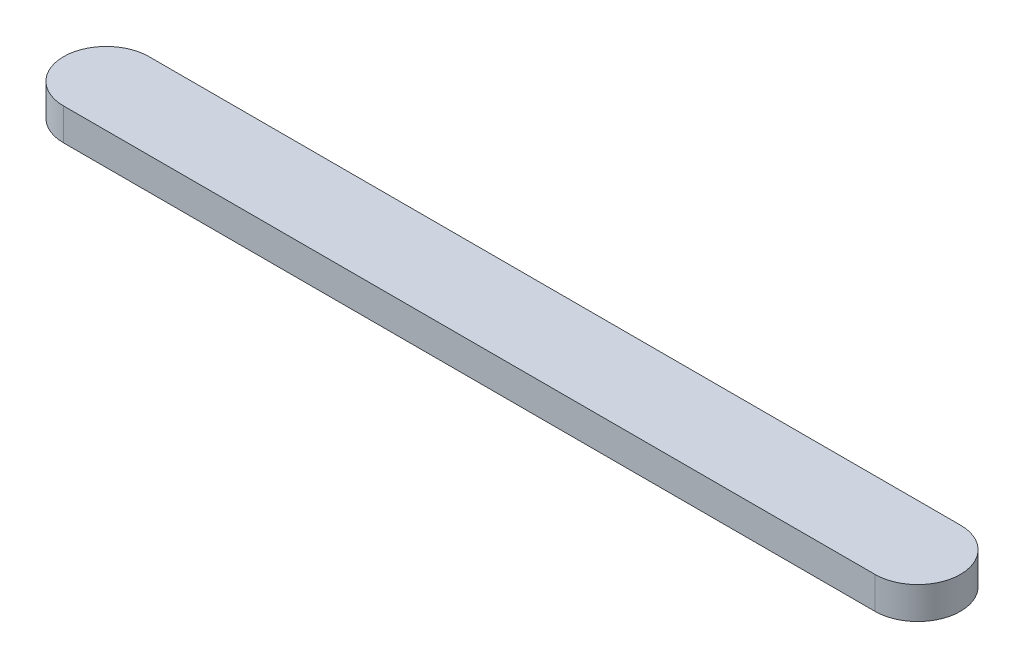
ISO-10303-21;
HEADER;
FILE_DESCRIPTION(('STEP AP214'),'2;1');
FILE_NAME('part.step','',(''),(''),'','','');
FILE_SCHEMA(('AUTOMOTIVE_DESIGN { 1 0 10303 214 1 1 1 1 }'));
ENDSEC;
DATA;
#1=APPLICATION_CONTEXT('core data for automotive mechanical design processes');
#2=APPLICATION_PROTOCOL_DEFINITION('international standard','automotive_design',2000,#1);
#3=PRODUCT_CONTEXT('',#1,'mechanical');
#4=PRODUCT('Part','Part','',(#3));
#5=PRODUCT_RELATED_PRODUCT_CATEGORY('part','',(#4));
#6=PRODUCT_DEFINITION_FORMATION('','',#4);
#7=PRODUCT_DEFINITION_CONTEXT('part definition',#1,'design');
#8=PRODUCT_DEFINITION('design','',#6,#7);
#9=PRODUCT_DEFINITION_SHAPE('','',#8);
#10=(LENGTH_UNIT() NAMED_UNIT(*) SI_UNIT(.MILLI.,.METRE.));
#11=(NAMED_UNIT(*) PLANE_ANGLE_UNIT() SI_UNIT($,.RADIAN.));
#12=(NAMED_UNIT(*) SI_UNIT($,.STERADIAN.) SOLID_ANGLE_UNIT());
#13=UNCERTAINTY_MEASURE_WITH_UNIT(LENGTH_MEASURE(1.E-05),#10,'distance_accuracy_value','');
#14=(GEOMETRIC_REPRESENTATION_CONTEXT(3) GLOBAL_UNCERTAINTY_ASSIGNED_CONTEXT((#13)) GLOBAL_UNIT_ASSIGNED_CONTEXT((#10,
#11,#12)) REPRESENTATION_CONTEXT('',''));
#15=CARTESIAN_POINT('',(0.,0.,0.));
#16=DIRECTION('',(0.,0.,1.));
#17=DIRECTION('',(1.,0.,0.));
#18=AXIS2_PLACEMENT_3D('',#15,#16,#17);
#19=CARTESIAN_POINT('',(0.,3.,0.));
#20=DIRECTION('',(0.,-1.,0.));
#21=DIRECTION('',(0.,0.,-1.));
#22=AXIS2_PLACEMENT_3D('',#19,#20,#21);
#23=CYLINDRICAL_SURFACE('',#22,4.);
#24=CARTESIAN_POINT('',(0.,0.,0.));
#25=DIRECTION('',(0.,1.,0.));
#26=DIRECTION('',(0.,0.,1.));
#27=AXIS2_PLACEMENT_3D('',#24,#25,#26);
#28=CIRCLE('',#27,4.);
#29=CARTESIAN_POINT('',(0.,0.,-4.));
#30=VERTEX_POINT('',#29);
#31=CARTESIAN_POINT('',(0.,0.,4.));
#32=VERTEX_POINT('',#31);
#33=EDGE_CURVE('E95',#30,#32,#28,.T.);
#34=ORIENTED_EDGE('',*,*,#33,.T.);
#35=DIRECTION('',(0.,-1.,0.));
#36=VECTOR('',#35,1.);
#37=CARTESIAN_POINT('',(0.,3.,4.));
#38=LINE('',#37,#36);
#39=CARTESIAN_POINT('',(0.,3.,4.));
#40=VERTEX_POINT('',#39);
#41=EDGE_CURVE('E11',#40,#32,#38,.T.);
#42=ORIENTED_EDGE('',*,*,#41,.F.);
#43=CARTESIAN_POINT('',(0.,3.,0.));
#44=DIRECTION('',(0.,1.,0.));
#45=DIRECTION('',(0.,0.,1.));
#46=AXIS2_PLACEMENT_3D('',#43,#44,#45);
#47=CIRCLE('',#46,4.);
#48=CARTESIAN_POINT('',(0.,3.,-4.));
#49=VERTEX_POINT('',#48);
#50=EDGE_CURVE('E83',#49,#40,#47,.T.);
#51=ORIENTED_EDGE('',*,*,#50,.F.);
#52=DIRECTION('',(0.,-1.,0.));
#53=VECTOR('',#52,1.);
#54=CARTESIAN_POINT('',(0.,3.,-4.));
#55=LINE('',#54,#53);
#56=EDGE_CURVE('E91',#49,#30,#55,.T.);
#57=ORIENTED_EDGE('',*,*,#56,.T.);
#58=EDGE_LOOP('',(#34,#42,#51,#57));
#59=FACE_BOUND('',#58,.T.);
#60=ADVANCED_FACE('F32',(#59),#23,.T.);
#61=CARTESIAN_POINT('',(0.,3.,4.));
#62=DIRECTION('',(0.,0.,-1.));
#63=DIRECTION('',(-1.,0.,0.));
#64=AXIS2_PLACEMENT_3D('',#61,#62,#63);
#65=PLANE('',#64);
#66=DIRECTION('',(1.,0.,0.));
#67=VECTOR('',#66,1.);
#68=CARTESIAN_POINT('',(0.,0.,4.));
#69=LINE('',#68,#67);
#70=CARTESIAN_POINT('',(76.,0.,4.));
#71=VERTEX_POINT('',#70);
#72=EDGE_CURVE('E87',#32,#71,#69,.T.);
#73=ORIENTED_EDGE('',*,*,#72,.T.);
#74=DIRECTION('',(0.,-1.,0.));
#75=VECTOR('',#74,1.);
#76=CARTESIAN_POINT('',(76.,3.,4.));
#77=LINE('',#76,#75);
#78=CARTESIAN_POINT('',(76.,3.,4.));
#79=VERTEX_POINT('',#78);
#80=EDGE_CURVE('E40',#79,#71,#77,.T.);
#81=ORIENTED_EDGE('',*,*,#80,.F.);
#82=DIRECTION('',(1.,0.,0.));
#83=VECTOR('',#82,1.);
#84=CARTESIAN_POINT('',(0.,3.,4.));
#85=LINE('',#84,#83);
#86=EDGE_CURVE('E78',#40,#79,#85,.T.);
#87=ORIENTED_EDGE('',*,*,#86,.F.);
#88=ORIENTED_EDGE('',*,*,#41,.T.);
#89=EDGE_LOOP('',(#73,#81,#87,#88));
#90=FACE_BOUND('',#89,.T.);
#91=ADVANCED_FACE('F86',(#90),#65,.F.);
#92=CARTESIAN_POINT('',(76.,3.,0.));
#93=DIRECTION('',(0.,-1.,0.));
#94=DIRECTION('',(0.,0.,-1.));
#95=AXIS2_PLACEMENT_3D('',#92,#93,#94);
#96=CYLINDRICAL_SURFACE('',#95,4.);
#97=CARTESIAN_POINT('',(76.,0.,0.));
#98=DIRECTION('',(0.,1.,0.));
#99=DIRECTION('',(0.,0.,1.));
#100=AXIS2_PLACEMENT_3D('',#97,#98,#99);
#101=CIRCLE('',#100,4.);
#102=CARTESIAN_POINT('',(76.,0.,-4.));
#103=VERTEX_POINT('',#102);
#104=EDGE_CURVE('E65',#71,#103,#101,.T.);
#105=ORIENTED_EDGE('',*,*,#104,.T.);
#106=DIRECTION('',(0.,-1.,0.));
#107=VECTOR('',#106,1.);
#108=CARTESIAN_POINT('',(76.,3.,-4.));
#109=LINE('',#108,#107);
#110=CARTESIAN_POINT('',(76.,3.,-4.));
#111=VERTEX_POINT('',#110);
#112=EDGE_CURVE('E88',#111,#103,#109,.T.);
#113=ORIENTED_EDGE('',*,*,#112,.F.);
#114=CARTESIAN_POINT('',(76.,3.,0.));
#115=DIRECTION('',(0.,1.,0.));
#116=DIRECTION('',(0.,0.,1.));
#117=AXIS2_PLACEMENT_3D('',#114,#115,#116);
#118=CIRCLE('',#117,4.);
#119=EDGE_CURVE('E81',#79,#111,#118,.T.);
#120=ORIENTED_EDGE('',*,*,#119,.F.);
#121=ORIENTED_EDGE('',*,*,#80,.T.);
#122=EDGE_LOOP('',(#105,#113,#120,#121));
#123=FACE_BOUND('',#122,.T.);
#124=ADVANCED_FACE('F89',(#123),#96,.T.);
#125=CARTESIAN_POINT('',(0.,3.,-4.));
#126=DIRECTION('',(0.,0.,1.));
#127=DIRECTION('',(1.,0.,0.));
#128=AXIS2_PLACEMENT_3D('',#125,#126,#127);
#129=PLANE('',#128);
#130=DIRECTION('',(-1.,0.,0.));
#131=VECTOR('',#130,1.);
#132=CARTESIAN_POINT('',(0.,0.,-4.));
#133=LINE('',#132,#131);
#134=EDGE_CURVE('E71',#103,#30,#133,.T.);
#135=ORIENTED_EDGE('',*,*,#134,.T.);
#136=ORIENTED_EDGE('',*,*,#56,.F.);
#137=DIRECTION('',(-1.,0.,0.));
#138=VECTOR('',#137,1.);
#139=CARTESIAN_POINT('',(0.,3.,-4.));
#140=LINE('',#139,#138);
#141=EDGE_CURVE('E48',#111,#49,#140,.T.);
#142=ORIENTED_EDGE('',*,*,#141,.F.);
#143=ORIENTED_EDGE('',*,*,#112,.T.);
#144=EDGE_LOOP('',(#135,#136,#142,#143));
#145=FACE_BOUND('',#144,.T.);
#146=ADVANCED_FACE('F102',(#145),#129,.F.);
#147=CARTESIAN_POINT('',(0.,3.,0.));
#148=DIRECTION('',(0.,1.,0.));
#149=DIRECTION('',(0.,0.,1.));
#150=AXIS2_PLACEMENT_3D('',#147,#148,#149);
#151=PLANE('',#150);
#152=ORIENTED_EDGE('',*,*,#50,.T.);
#153=ORIENTED_EDGE('',*,*,#86,.T.);
#154=ORIENTED_EDGE('',*,*,#119,.T.);
#155=ORIENTED_EDGE('',*,*,#141,.T.);
#156=EDGE_LOOP('',(#152,#153,#154,#155));
#157=FACE_BOUND('',#156,.T.);
#158=ADVANCED_FACE('F79',(#157),#151,.T.);
#159=CARTESIAN_POINT('',(0.,0.,0.));
#160=DIRECTION('',(0.,1.,0.));
#161=DIRECTION('',(0.,0.,1.));
#162=AXIS2_PLACEMENT_3D('',#159,#160,#161);
#163=PLANE('',#162);
#164=ORIENTED_EDGE('',*,*,#33,.F.);
#165=ORIENTED_EDGE('',*,*,#134,.F.);
#166=ORIENTED_EDGE('',*,*,#104,.F.);
#167=ORIENTED_EDGE('',*,*,#72,.F.);
#168=EDGE_LOOP('',(#164,#165,#166,#167));
#169=FACE_BOUND('',#168,.T.);
#170=ADVANCED_FACE('F105',(#169),#163,.F.);
#171=CLOSED_SHELL('',(#60,#91,#124,#146,#158,#170));
#172=MANIFOLD_SOLID_BREP('B2',#171);
#173=ADVANCED_BREP_SHAPE_REPRESENTATION('',(#18,#172),#14);
#174=SHAPE_DEFINITION_REPRESENTATION(#9,#173);
ENDSEC;
END-ISO-10303-21;
